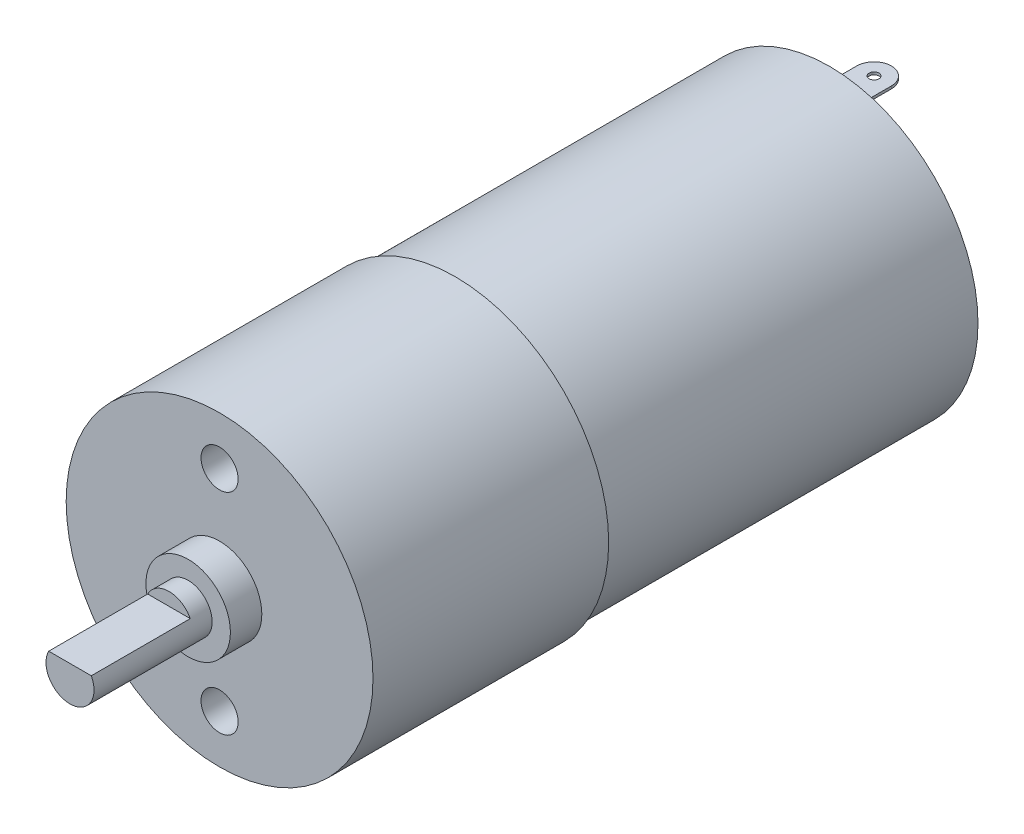
ISO-10303-21;
HEADER;
FILE_DESCRIPTION(('STEP AP214'),'2;1');
FILE_NAME('part.step','',(''),(''),'','','');
FILE_SCHEMA(('AUTOMOTIVE_DESIGN { 1 0 10303 214 1 1 1 1 }'));
ENDSEC;
DATA;
#1=APPLICATION_CONTEXT('core data for automotive mechanical design processes');
#2=APPLICATION_PROTOCOL_DEFINITION('international standard','automotive_design',2000,#1);
#3=PRODUCT_CONTEXT('',#1,'mechanical');
#4=PRODUCT('Part','Part','',(#3));
#5=PRODUCT_RELATED_PRODUCT_CATEGORY('part','',(#4));
#6=PRODUCT_DEFINITION_FORMATION('','',#4);
#7=PRODUCT_DEFINITION_CONTEXT('part definition',#1,'design');
#8=PRODUCT_DEFINITION('design','',#6,#7);
#9=PRODUCT_DEFINITION_SHAPE('','',#8);
#10=(LENGTH_UNIT() NAMED_UNIT(*) SI_UNIT(.MILLI.,.METRE.));
#11=(NAMED_UNIT(*) PLANE_ANGLE_UNIT() SI_UNIT($,.RADIAN.));
#12=(NAMED_UNIT(*) SI_UNIT($,.STERADIAN.) SOLID_ANGLE_UNIT());
#13=UNCERTAINTY_MEASURE_WITH_UNIT(LENGTH_MEASURE(1.E-05),#10,'distance_accuracy_value','');
#14=(GEOMETRIC_REPRESENTATION_CONTEXT(3) GLOBAL_UNCERTAINTY_ASSIGNED_CONTEXT((#13)) GLOBAL_UNIT_ASSIGNED_CONTEXT((#10,
#11,#12)) REPRESENTATION_CONTEXT('',''));
#15=CARTESIAN_POINT('',(0.,0.,0.));
#16=DIRECTION('',(0.,0.,1.));
#17=DIRECTION('',(1.,0.,0.));
#18=AXIS2_PLACEMENT_3D('',#15,#16,#17);
#19=CARTESIAN_POINT('',(0.,0.,-49.3));
#20=DIRECTION('',(0.,0.,-1.));
#21=DIRECTION('',(-1.,0.,0.));
#22=AXIS2_PLACEMENT_3D('',#19,#20,#21);
#23=PLANE('',#22);
#24=DIRECTION('',(-1.,0.,0.));
#25=VECTOR('',#24,1.);
#26=CARTESIAN_POINT('',(1.4,9.315,-49.3));
#27=LINE('',#26,#25);
#28=CARTESIAN_POINT('',(1.4,9.315,-49.3));
#29=VERTEX_POINT('',#28);
#30=CARTESIAN_POINT('',(-1.4,9.315,-49.3));
#31=VERTEX_POINT('',#30);
#32=EDGE_CURVE('E170',#29,#31,#27,.T.);
#33=ORIENTED_EDGE('',*,*,#32,.F.);
#34=DIRECTION('',(0.,-1.,0.));
#35=VECTOR('',#34,1.);
#36=CARTESIAN_POINT('',(1.4,9.525,-49.3));
#37=LINE('',#36,#35);
#38=CARTESIAN_POINT('',(1.4,9.525,-49.3));
#39=VERTEX_POINT('',#38);
#40=EDGE_CURVE('E143',#39,#29,#37,.T.);
#41=ORIENTED_EDGE('',*,*,#40,.F.);
#42=DIRECTION('',(1.,0.,0.));
#43=VECTOR('',#42,1.);
#44=CARTESIAN_POINT('',(1.4,9.525,-49.3));
#45=LINE('',#44,#43);
#46=CARTESIAN_POINT('',(-1.4,9.525,-49.3));
#47=VERTEX_POINT('',#46);
#48=EDGE_CURVE('E176',#47,#39,#45,.T.);
#49=ORIENTED_EDGE('',*,*,#48,.F.);
#50=DIRECTION('',(0.,1.,0.));
#51=VECTOR('',#50,1.);
#52=CARTESIAN_POINT('',(-1.4,9.525,-49.3));
#53=LINE('',#52,#51);
#54=EDGE_CURVE('E173',#31,#47,#53,.T.);
#55=ORIENTED_EDGE('',*,*,#54,.F.);
#56=EDGE_LOOP('',(#33,#41,#49,#55));
#57=FACE_BOUND('',#56,.T.);
#58=CARTESIAN_POINT('',(0.,0.,-49.3));
#59=DIRECTION('',(0.,0.,-1.));
#60=DIRECTION('',(-1.,0.,0.));
#61=AXIS2_PLACEMENT_3D('',#58,#59,#60);
#62=CIRCLE('',#61,12.);
#63=CARTESIAN_POINT('',(-12.,0.,-49.3));
#64=VERTEX_POINT('',#63);
#65=EDGE_CURVE('E202',#64,#64,#62,.T.);
#66=ORIENTED_EDGE('',*,*,#65,.T.);
#67=EDGE_LOOP('',(#66));
#68=FACE_BOUND('',#67,.T.);
#69=DIRECTION('',(0.,1.,0.));
#70=VECTOR('',#69,1.);
#71=CARTESIAN_POINT('',(-3.2,2.70482901492867,-49.3));
#72=LINE('',#71,#70);
#73=CARTESIAN_POINT('',(-3.2,-2.70482901492867,-49.3));
#74=VERTEX_POINT('',#73);
#75=CARTESIAN_POINT('',(-3.2,2.70482901492867,-49.3));
#76=VERTEX_POINT('',#75);
#77=EDGE_CURVE('E189',#74,#76,#72,.T.);
#78=ORIENTED_EDGE('',*,*,#77,.F.);
#79=CARTESIAN_POINT('',(0.,0.,-49.3));
#80=DIRECTION('',(0.,0.,-1.));
#81=DIRECTION('',(-1.,0.,0.));
#82=AXIS2_PLACEMENT_3D('',#79,#80,#81);
#83=CIRCLE('',#82,4.19);
#84=EDGE_CURVE('E187',#76,#74,#83,.T.);
#85=ORIENTED_EDGE('',*,*,#84,.F.);
#86=EDGE_LOOP('',(#78,#85));
#87=FACE_BOUND('',#86,.T.);
#88=DIRECTION('',(-1.,0.,0.));
#89=VECTOR('',#88,1.);
#90=CARTESIAN_POINT('',(1.4,-9.525,-49.3));
#91=LINE('',#90,#89);
#92=CARTESIAN_POINT('',(1.4,-9.525,-49.3));
#93=VERTEX_POINT('',#92);
#94=CARTESIAN_POINT('',(-1.4,-9.525,-49.3));
#95=VERTEX_POINT('',#94);
#96=EDGE_CURVE('E137',#93,#95,#91,.T.);
#97=ORIENTED_EDGE('',*,*,#96,.F.);
#98=DIRECTION('',(0.,-1.,0.));
#99=VECTOR('',#98,1.);
#100=CARTESIAN_POINT('',(1.4,-9.315,-49.3));
#101=LINE('',#100,#99);
#102=CARTESIAN_POINT('',(1.4,-9.315,-49.3));
#103=VERTEX_POINT('',#102);
#104=EDGE_CURVE('E147',#103,#93,#101,.T.);
#105=ORIENTED_EDGE('',*,*,#104,.F.);
#106=DIRECTION('',(1.,0.,0.));
#107=VECTOR('',#106,1.);
#108=CARTESIAN_POINT('',(1.4,-9.315,-49.3));
#109=LINE('',#108,#107);
#110=CARTESIAN_POINT('',(-1.4,-9.315,-49.3));
#111=VERTEX_POINT('',#110);
#112=EDGE_CURVE('E159',#111,#103,#109,.T.);
#113=ORIENTED_EDGE('',*,*,#112,.F.);
#114=DIRECTION('',(0.,1.,0.));
#115=VECTOR('',#114,1.);
#116=CARTESIAN_POINT('',(-1.4,-9.315,-49.3));
#117=LINE('',#116,#115);
#118=EDGE_CURVE('E157',#95,#111,#117,.T.);
#119=ORIENTED_EDGE('',*,*,#118,.F.);
#120=EDGE_LOOP('',(#97,#105,#113,#119));
#121=FACE_BOUND('',#120,.T.);
#122=ADVANCED_FACE('F34',(#57,#68,#87,#121),#23,.T.);
#123=CARTESIAN_POINT('',(0.,0.,-19.05));
#124=DIRECTION('',(0.,0.,1.));
#125=DIRECTION('',(1.,0.,0.));
#126=AXIS2_PLACEMENT_3D('',#123,#124,#125);
#127=PLANE('',#126);
#128=CARTESIAN_POINT('',(0.,0.,-19.05));
#129=DIRECTION('',(0.,0.,1.));
#130=DIRECTION('',(1.,0.,0.));
#131=AXIS2_PLACEMENT_3D('',#128,#129,#130);
#132=CIRCLE('',#131,12.4);
#133=CARTESIAN_POINT('',(12.4,0.,-19.05));
#134=VERTEX_POINT('',#133);
#135=EDGE_CURVE('E229',#134,#134,#132,.T.);
#136=ORIENTED_EDGE('',*,*,#135,.F.);
#137=EDGE_LOOP('',(#136));
#138=FACE_BOUND('',#137,.T.);
#139=CARTESIAN_POINT('',(0.,0.,-19.05));
#140=DIRECTION('',(0.,0.,1.));
#141=DIRECTION('',(1.,0.,0.));
#142=AXIS2_PLACEMENT_3D('',#139,#140,#141);
#143=CIRCLE('',#142,12.);
#144=CARTESIAN_POINT('',(12.,0.,-19.05));
#145=VERTEX_POINT('',#144);
#146=EDGE_CURVE('E236',#145,#145,#143,.F.);
#147=ORIENTED_EDGE('',*,*,#146,.F.);
#148=EDGE_LOOP('',(#147));
#149=FACE_BOUND('',#148,.T.);
#150=ADVANCED_FACE('F335',(#138,#149),#127,.F.);
#151=CARTESIAN_POINT('',(0.,0.,2.54));
#152=DIRECTION('',(0.,0.,1.));
#153=DIRECTION('',(1.,0.,0.));
#154=AXIS2_PLACEMENT_3D('',#151,#152,#153);
#155=PLANE('',#154);
#156=CARTESIAN_POINT('',(0.,0.,2.54));
#157=DIRECTION('',(0.,0.,1.));
#158=DIRECTION('',(1.,0.,0.));
#159=AXIS2_PLACEMENT_3D('',#156,#157,#158);
#160=CIRCLE('',#159,3.415);
#161=CARTESIAN_POINT('',(3.415,0.,2.54));
#162=VERTEX_POINT('',#161);
#163=EDGE_CURVE('E223',#162,#162,#160,.T.);
#164=ORIENTED_EDGE('',*,*,#163,.T.);
#165=EDGE_LOOP('',(#164));
#166=FACE_BOUND('',#165,.T.);
#167=CARTESIAN_POINT('',(0.,0.,2.54));
#168=DIRECTION('',(0.,0.,1.));
#169=DIRECTION('',(1.,0.,0.));
#170=AXIS2_PLACEMENT_3D('',#167,#168,#169);
#171=CIRCLE('',#170,1.94);
#172=CARTESIAN_POINT('',(1.94,0.,2.54));
#173=VERTEX_POINT('',#172);
#174=EDGE_CURVE('E214',#173,#173,#171,.T.);
#175=ORIENTED_EDGE('',*,*,#174,.F.);
#176=EDGE_LOOP('',(#175));
#177=FACE_BOUND('',#176,.T.);
#178=ADVANCED_FACE('F311',(#166,#177),#155,.T.);
#179=CARTESIAN_POINT('',(0.,0.,0.));
#180=DIRECTION('',(0.,0.,1.));
#181=DIRECTION('',(1.,0.,0.));
#182=AXIS2_PLACEMENT_3D('',#179,#180,#181);
#183=PLANE('',#182);
#184=CARTESIAN_POINT('',(0.,-8.5,0.));
#185=DIRECTION('',(0.,0.,1.));
#186=DIRECTION('',(1.,0.,0.));
#187=AXIS2_PLACEMENT_3D('',#184,#185,#186);
#188=CIRCLE('',#187,1.5);
#189=CARTESIAN_POINT('',(1.5,-8.5,0.));
#190=VERTEX_POINT('',#189);
#191=EDGE_CURVE('E302',#190,#190,#188,.T.);
#192=ORIENTED_EDGE('',*,*,#191,.F.);
#193=EDGE_LOOP('',(#192));
#194=FACE_BOUND('',#193,.T.);
#195=CARTESIAN_POINT('',(0.,8.5,0.));
#196=DIRECTION('',(0.,0.,1.));
#197=DIRECTION('',(1.,0.,0.));
#198=AXIS2_PLACEMENT_3D('',#195,#196,#197);
#199=CIRCLE('',#198,1.5);
#200=CARTESIAN_POINT('',(1.5,8.5,0.));
#201=VERTEX_POINT('',#200);
#202=EDGE_CURVE('E296',#201,#201,#199,.T.);
#203=ORIENTED_EDGE('',*,*,#202,.F.);
#204=EDGE_LOOP('',(#203));
#205=FACE_BOUND('',#204,.T.);
#206=CARTESIAN_POINT('',(0.,0.,0.));
#207=DIRECTION('',(0.,0.,1.));
#208=DIRECTION('',(1.,0.,0.));
#209=AXIS2_PLACEMENT_3D('',#206,#207,#208);
#210=CIRCLE('',#209,12.4);
#211=CARTESIAN_POINT('',(12.4,0.,0.));
#212=VERTEX_POINT('',#211);
#213=EDGE_CURVE('E226',#212,#212,#210,.T.);
#214=ORIENTED_EDGE('',*,*,#213,.T.);
#215=EDGE_LOOP('',(#214));
#216=FACE_BOUND('',#215,.T.);
#217=CARTESIAN_POINT('',(0.,0.,0.));
#218=DIRECTION('',(0.,0.,1.));
#219=DIRECTION('',(1.,0.,0.));
#220=AXIS2_PLACEMENT_3D('',#217,#218,#219);
#221=CIRCLE('',#220,3.415);
#222=CARTESIAN_POINT('',(3.415,0.,0.));
#223=VERTEX_POINT('',#222);
#224=EDGE_CURVE('E220',#223,#223,#221,.T.);
#225=ORIENTED_EDGE('',*,*,#224,.F.);
#226=EDGE_LOOP('',(#225));
#227=FACE_BOUND('',#226,.T.);
#228=ADVANCED_FACE('F308',(#194,#205,#216,#227),#183,.T.);
#229=CARTESIAN_POINT('',(0.,0.,-19.05));
#230=DIRECTION('',(0.,0.,1.));
#231=DIRECTION('',(1.,0.,0.));
#232=AXIS2_PLACEMENT_3D('',#229,#230,#231);
#233=CYLINDRICAL_SURFACE('',#232,12.4);
#234=ORIENTED_EDGE('',*,*,#135,.T.);
#235=EDGE_LOOP('',(#234));
#236=FACE_BOUND('',#235,.T.);
#237=ORIENTED_EDGE('',*,*,#213,.F.);
#238=EDGE_LOOP('',(#237));
#239=FACE_BOUND('',#238,.T.);
#240=ADVANCED_FACE('F36',(#236,#239),#233,.T.);
#241=CARTESIAN_POINT('',(0.,0.,2.54));
#242=DIRECTION('',(0.,0.,-1.));
#243=DIRECTION('',(-1.,0.,0.));
#244=AXIS2_PLACEMENT_3D('',#241,#242,#243);
#245=CYLINDRICAL_SURFACE('',#244,3.415);
#246=ORIENTED_EDGE('',*,*,#163,.F.);
#247=EDGE_LOOP('',(#246));
#248=FACE_BOUND('',#247,.T.);
#249=ORIENTED_EDGE('',*,*,#224,.T.);
#250=EDGE_LOOP('',(#249));
#251=FACE_BOUND('',#250,.T.);
#252=ADVANCED_FACE('F319',(#248,#251),#245,.T.);
#253=CARTESIAN_POINT('',(0.,0.,12.09));
#254=DIRECTION('',(0.,0.,-1.));
#255=DIRECTION('',(-1.,0.,0.));
#256=AXIS2_PLACEMENT_3D('',#253,#254,#255);
#257=CYLINDRICAL_SURFACE('',#256,1.94);
#258=CARTESIAN_POINT('',(0.,0.,12.09));
#259=DIRECTION('',(0.,0.,1.));
#260=DIRECTION('',(1.,0.,0.));
#261=AXIS2_PLACEMENT_3D('',#258,#259,#260);
#262=CIRCLE('',#261,1.94);
#263=CARTESIAN_POINT('',(-1.72122780344341,0.89497198204936,12.09));
#264=VERTEX_POINT('',#263);
#265=CARTESIAN_POINT('',(1.72122780344341,0.89497198204936,12.09));
#266=VERTEX_POINT('',#265);
#267=EDGE_CURVE('E217',#264,#266,#262,.T.);
#268=ORIENTED_EDGE('',*,*,#267,.F.);
#269=DIRECTION('',(0.,0.,-1.));
#270=VECTOR('',#269,1.);
#271=CARTESIAN_POINT('',(-1.72122780344341,0.89497198204936,12.09));
#272=LINE('',#271,#270);
#273=CARTESIAN_POINT('',(-1.72122780344341,0.89497198204936,4.09));
#274=VERTEX_POINT('',#273);
#275=EDGE_CURVE('E211',#264,#274,#272,.T.);
#276=ORIENTED_EDGE('',*,*,#275,.T.);
#277=CARTESIAN_POINT('',(0.,0.,4.09));
#278=DIRECTION('',(0.,0.,1.));
#279=DIRECTION('',(1.,0.,0.));
#280=AXIS2_PLACEMENT_3D('',#277,#278,#279);
#281=CIRCLE('',#280,1.94);
#282=CARTESIAN_POINT('',(1.72122780344341,0.89497198204936,4.09));
#283=VERTEX_POINT('',#282);
#284=EDGE_CURVE('E234',#283,#274,#281,.T.);
#285=ORIENTED_EDGE('',*,*,#284,.F.);
#286=DIRECTION('',(0.,0.,-1.));
#287=VECTOR('',#286,1.);
#288=CARTESIAN_POINT('',(1.72122780344341,0.89497198204936,12.09));
#289=LINE('',#288,#287);
#290=EDGE_CURVE('E208',#283,#266,#289,.F.);
#291=ORIENTED_EDGE('',*,*,#290,.T.);
#292=EDGE_LOOP('',(#268,#276,#285,#291));
#293=FACE_BOUND('',#292,.T.);
#294=ORIENTED_EDGE('',*,*,#174,.T.);
#295=EDGE_LOOP('',(#294));
#296=FACE_BOUND('',#295,.T.);
#297=ADVANCED_FACE('F321',(#293,#296),#257,.T.);
#298=CARTESIAN_POINT('',(0.,0.,12.09));
#299=DIRECTION('',(0.,0.,1.));
#300=DIRECTION('',(1.,0.,0.));
#301=AXIS2_PLACEMENT_3D('',#298,#299,#300);
#302=PLANE('',#301);
#303=DIRECTION('',(1.,0.,0.));
#304=VECTOR('',#303,1.);
#305=CARTESIAN_POINT('',(0.,0.89497198204936,12.09));
#306=LINE('',#305,#304);
#307=EDGE_CURVE('E232',#264,#266,#306,.T.);
#308=ORIENTED_EDGE('',*,*,#307,.F.);
#309=ORIENTED_EDGE('',*,*,#267,.T.);
#310=EDGE_LOOP('',(#308,#309));
#311=FACE_BOUND('',#310,.T.);
#312=ADVANCED_FACE('F328',(#311),#302,.T.);
#313=CARTESIAN_POINT('',(0.,0.,4.09));
#314=DIRECTION('',(0.,0.,1.));
#315=DIRECTION('',(1.,0.,0.));
#316=AXIS2_PLACEMENT_3D('',#313,#314,#315);
#317=PLANE('',#316);
#318=ORIENTED_EDGE('',*,*,#284,.T.);
#319=DIRECTION('',(1.,0.,0.));
#320=VECTOR('',#319,1.);
#321=CARTESIAN_POINT('',(-2.33431470700646,0.89497198204936,4.09));
#322=LINE('',#321,#320);
#323=EDGE_CURVE('E205',#274,#283,#322,.T.);
#324=ORIENTED_EDGE('',*,*,#323,.T.);
#325=EDGE_LOOP('',(#318,#324));
#326=FACE_BOUND('',#325,.T.);
#327=ADVANCED_FACE('F350',(#326),#317,.T.);
#328=CARTESIAN_POINT('',(-2.33431470700646,0.89497198204936,4.09));
#329=DIRECTION('',(0.,-1.,0.));
#330=DIRECTION('',(0.,0.,-1.));
#331=AXIS2_PLACEMENT_3D('',#328,#329,#330);
#332=PLANE('',#331);
#333=ORIENTED_EDGE('',*,*,#307,.T.);
#334=ORIENTED_EDGE('',*,*,#290,.F.);
#335=ORIENTED_EDGE('',*,*,#323,.F.);
#336=ORIENTED_EDGE('',*,*,#275,.F.);
#337=EDGE_LOOP('',(#333,#334,#335,#336));
#338=FACE_BOUND('',#337,.T.);
#339=ADVANCED_FACE('F348',(#338),#332,.F.);
#340=CARTESIAN_POINT('',(0.,0.,-49.3));
#341=DIRECTION('',(0.,0.,1.));
#342=DIRECTION('',(1.,0.,0.));
#343=AXIS2_PLACEMENT_3D('',#340,#341,#342);
#344=CYLINDRICAL_SURFACE('',#343,12.);
#345=ORIENTED_EDGE('',*,*,#65,.F.);
#346=EDGE_LOOP('',(#345));
#347=FACE_BOUND('',#346,.T.);
#348=ORIENTED_EDGE('',*,*,#146,.T.);
#349=EDGE_LOOP('',(#348));
#350=FACE_BOUND('',#349,.T.);
#351=ADVANCED_FACE('F345',(#347,#350),#344,.T.);
#352=CARTESIAN_POINT('',(0.,0.,-51.3));
#353=DIRECTION('',(0.,0.,1.));
#354=DIRECTION('',(1.,0.,0.));
#355=AXIS2_PLACEMENT_3D('',#352,#353,#354);
#356=CYLINDRICAL_SURFACE('',#355,4.19);
#357=ORIENTED_EDGE('',*,*,#84,.T.);
#358=DIRECTION('',(0.,0.,1.));
#359=VECTOR('',#358,1.);
#360=CARTESIAN_POINT('',(-3.2,-2.70482901492867,-51.3));
#361=LINE('',#360,#359);
#362=CARTESIAN_POINT('',(-3.2,-2.70482901492867,-51.3));
#363=VERTEX_POINT('',#362);
#364=EDGE_CURVE('E199',#363,#74,#361,.T.);
#365=ORIENTED_EDGE('',*,*,#364,.F.);
#366=CARTESIAN_POINT('',(0.,0.,-51.3));
#367=DIRECTION('',(0.,0.,-1.));
#368=DIRECTION('',(-1.,0.,0.));
#369=AXIS2_PLACEMENT_3D('',#366,#367,#368);
#370=CIRCLE('',#369,4.19);
#371=CARTESIAN_POINT('',(-3.2,2.70482901492867,-51.3));
#372=VERTEX_POINT('',#371);
#373=EDGE_CURVE('E191',#372,#363,#370,.T.);
#374=ORIENTED_EDGE('',*,*,#373,.F.);
#375=DIRECTION('',(0.,0.,1.));
#376=VECTOR('',#375,1.);
#377=CARTESIAN_POINT('',(-3.2,2.70482901492867,-51.3));
#378=LINE('',#377,#376);
#379=EDGE_CURVE('E196',#372,#76,#378,.T.);
#380=ORIENTED_EDGE('',*,*,#379,.T.);
#381=EDGE_LOOP('',(#357,#365,#374,#380));
#382=FACE_BOUND('',#381,.T.);
#383=ADVANCED_FACE('F343',(#382),#356,.T.);
#384=CARTESIAN_POINT('',(-3.2,2.70482901492867,-51.3));
#385=DIRECTION('',(1.,0.,0.));
#386=DIRECTION('',(0.,1.,0.));
#387=AXIS2_PLACEMENT_3D('',#384,#385,#386);
#388=PLANE('',#387);
#389=ORIENTED_EDGE('',*,*,#77,.T.);
#390=ORIENTED_EDGE('',*,*,#379,.F.);
#391=DIRECTION('',(0.,1.,0.));
#392=VECTOR('',#391,1.);
#393=CARTESIAN_POINT('',(-3.2,2.70482901492867,-51.3));
#394=LINE('',#393,#392);
#395=EDGE_CURVE('E194',#363,#372,#394,.T.);
#396=ORIENTED_EDGE('',*,*,#395,.F.);
#397=ORIENTED_EDGE('',*,*,#364,.T.);
#398=EDGE_LOOP('',(#389,#390,#396,#397));
#399=FACE_BOUND('',#398,.T.);
#400=ADVANCED_FACE('F420',(#399),#388,.F.);
#401=CARTESIAN_POINT('',(0.,0.,-51.3));
#402=DIRECTION('',(0.,0.,-1.));
#403=DIRECTION('',(-1.,0.,0.));
#404=AXIS2_PLACEMENT_3D('',#401,#402,#403);
#405=PLANE('',#404);
#406=ORIENTED_EDGE('',*,*,#373,.T.);
#407=ORIENTED_EDGE('',*,*,#395,.T.);
#408=EDGE_LOOP('',(#406,#407));
#409=FACE_BOUND('',#408,.T.);
#410=ADVANCED_FACE('F429',(#409),#405,.T.);
#411=CARTESIAN_POINT('',(1.4,9.525,-54.3));
#412=DIRECTION('',(-1.,0.,0.));
#413=DIRECTION('',(0.,0.,1.));
#414=AXIS2_PLACEMENT_3D('',#411,#412,#413);
#415=PLANE('',#414);
#416=DIRECTION('',(0.,0.,1.));
#417=VECTOR('',#416,1.);
#418=CARTESIAN_POINT('',(1.4,9.315,-54.3));
#419=LINE('',#418,#417);
#420=CARTESIAN_POINT('',(1.4,9.315,-52.9));
#421=VERTEX_POINT('',#420);
#422=EDGE_CURVE('E185',#421,#29,#419,.T.);
#423=ORIENTED_EDGE('',*,*,#422,.F.);
#424=DIRECTION('',(0.,-1.,0.));
#425=VECTOR('',#424,1.);
#426=CARTESIAN_POINT('',(1.4,9.525,-52.9));
#427=LINE('',#426,#425);
#428=CARTESIAN_POINT('',(1.4,9.525,-52.9));
#429=VERTEX_POINT('',#428);
#430=EDGE_CURVE('E11',#421,#429,#427,.F.);
#431=ORIENTED_EDGE('',*,*,#430,.T.);
#432=DIRECTION('',(0.,0.,1.));
#433=VECTOR('',#432,1.);
#434=CARTESIAN_POINT('',(1.4,9.525,-54.3));
#435=LINE('',#434,#433);
#436=EDGE_CURVE('E179',#429,#39,#435,.T.);
#437=ORIENTED_EDGE('',*,*,#436,.T.);
#438=ORIENTED_EDGE('',*,*,#40,.T.);
#439=EDGE_LOOP('',(#423,#431,#437,#438));
#440=FACE_BOUND('',#439,.T.);
#441=ADVANCED_FACE('F438',(#440),#415,.F.);
#442=CARTESIAN_POINT('',(1.4,9.315,-54.3));
#443=DIRECTION('',(0.,1.,0.));
#444=DIRECTION('',(0.,0.,1.));
#445=AXIS2_PLACEMENT_3D('',#442,#443,#444);
#446=PLANE('',#445);
#447=CARTESIAN_POINT('',(0.,9.315,-52.9));
#448=DIRECTION('',(0.,1.,0.));
#449=DIRECTION('',(0.,0.,1.));
#450=AXIS2_PLACEMENT_3D('',#447,#448,#449);
#451=CIRCLE('',#450,0.399999999999999);
#452=CARTESIAN_POINT('',(0.,9.315,-52.5));
#453=VERTEX_POINT('',#452);
#454=EDGE_CURVE('E281',#453,#453,#451,.T.);
#455=ORIENTED_EDGE('',*,*,#454,.T.);
#456=EDGE_LOOP('',(#455));
#457=FACE_BOUND('',#456,.T.);
#458=DIRECTION('',(0.,0.,1.));
#459=VECTOR('',#458,1.);
#460=CARTESIAN_POINT('',(-1.4,9.315,-54.3));
#461=LINE('',#460,#459);
#462=CARTESIAN_POINT('',(-1.4,9.315,-52.9));
#463=VERTEX_POINT('',#462);
#464=EDGE_CURVE('E183',#463,#31,#461,.T.);
#465=ORIENTED_EDGE('',*,*,#464,.F.);
#466=CARTESIAN_POINT('',(0.,9.315,-52.9));
#467=DIRECTION('',(0.,1.,0.));
#468=DIRECTION('',(0.,0.,1.));
#469=AXIS2_PLACEMENT_3D('',#466,#467,#468);
#470=CIRCLE('',#469,1.4);
#471=CARTESIAN_POINT('',(0.,9.315,-54.3));
#472=VERTEX_POINT('',#471);
#473=EDGE_CURVE('E43',#463,#472,#470,.F.);
#474=ORIENTED_EDGE('',*,*,#473,.T.);
#475=CARTESIAN_POINT('',(0.,9.315,-52.9));
#476=DIRECTION('',(0.,1.,0.));
#477=DIRECTION('',(0.,0.,1.));
#478=AXIS2_PLACEMENT_3D('',#475,#476,#477);
#479=CIRCLE('',#478,1.4);
#480=EDGE_CURVE('E50',#472,#421,#479,.F.);
#481=ORIENTED_EDGE('',*,*,#480,.T.);
#482=ORIENTED_EDGE('',*,*,#422,.T.);
#483=ORIENTED_EDGE('',*,*,#32,.T.);
#484=EDGE_LOOP('',(#465,#474,#481,#482,#483));
#485=FACE_BOUND('',#484,.T.);
#486=ADVANCED_FACE('F265',(#457,#485),#446,.F.);
#487=CARTESIAN_POINT('',(-1.4,9.525,-54.3));
#488=DIRECTION('',(1.,0.,0.));
#489=DIRECTION('',(0.,0.,-1.));
#490=AXIS2_PLACEMENT_3D('',#487,#488,#489);
#491=PLANE('',#490);
#492=DIRECTION('',(0.,0.,1.));
#493=VECTOR('',#492,1.);
#494=CARTESIAN_POINT('',(-1.4,9.525,-54.3));
#495=LINE('',#494,#493);
#496=CARTESIAN_POINT('',(-1.4,9.525,-52.9));
#497=VERTEX_POINT('',#496);
#498=EDGE_CURVE('E181',#497,#47,#495,.T.);
#499=ORIENTED_EDGE('',*,*,#498,.F.);
#500=DIRECTION('',(0.,1.,0.));
#501=VECTOR('',#500,1.);
#502=CARTESIAN_POINT('',(-1.4,9.315,-52.9));
#503=LINE('',#502,#501);
#504=EDGE_CURVE('E255',#497,#463,#503,.F.);
#505=ORIENTED_EDGE('',*,*,#504,.T.);
#506=ORIENTED_EDGE('',*,*,#464,.T.);
#507=ORIENTED_EDGE('',*,*,#54,.T.);
#508=EDGE_LOOP('',(#499,#505,#506,#507));
#509=FACE_BOUND('',#508,.T.);
#510=ADVANCED_FACE('F262',(#509),#491,.F.);
#511=CARTESIAN_POINT('',(1.4,9.525,-54.3));
#512=DIRECTION('',(0.,-1.,0.));
#513=DIRECTION('',(0.,0.,-1.));
#514=AXIS2_PLACEMENT_3D('',#511,#512,#513);
#515=PLANE('',#514);
#516=CARTESIAN_POINT('',(0.,9.525,-52.9));
#517=DIRECTION('',(0.,1.,0.));
#518=DIRECTION('',(0.,0.,1.));
#519=AXIS2_PLACEMENT_3D('',#516,#517,#518);
#520=CIRCLE('',#519,0.399999999999999);
#521=CARTESIAN_POINT('',(0.,9.525,-52.5));
#522=VERTEX_POINT('',#521);
#523=EDGE_CURVE('E290',#522,#522,#520,.T.);
#524=ORIENTED_EDGE('',*,*,#523,.F.);
#525=EDGE_LOOP('',(#524));
#526=FACE_BOUND('',#525,.T.);
#527=CARTESIAN_POINT('',(0.,9.525,-52.9));
#528=DIRECTION('',(0.,-1.,0.));
#529=DIRECTION('',(0.,0.,-1.));
#530=AXIS2_PLACEMENT_3D('',#527,#528,#529);
#531=CIRCLE('',#530,1.4);
#532=CARTESIAN_POINT('',(0.,9.525,-54.3));
#533=VERTEX_POINT('',#532);
#534=EDGE_CURVE('E251',#429,#533,#531,.F.);
#535=ORIENTED_EDGE('',*,*,#534,.T.);
#536=CARTESIAN_POINT('',(0.,9.525,-52.9));
#537=DIRECTION('',(0.,-1.,0.));
#538=DIRECTION('',(0.,0.,-1.));
#539=AXIS2_PLACEMENT_3D('',#536,#537,#538);
#540=CIRCLE('',#539,1.4);
#541=EDGE_CURVE('E253',#533,#497,#540,.F.);
#542=ORIENTED_EDGE('',*,*,#541,.T.);
#543=ORIENTED_EDGE('',*,*,#498,.T.);
#544=ORIENTED_EDGE('',*,*,#48,.T.);
#545=ORIENTED_EDGE('',*,*,#436,.F.);
#546=EDGE_LOOP('',(#535,#542,#543,#544,#545));
#547=FACE_BOUND('',#546,.T.);
#548=ADVANCED_FACE('F274',(#526,#547),#515,.F.);
#549=CARTESIAN_POINT('',(1.4,-9.315,-54.3));
#550=DIRECTION('',(-1.,0.,0.));
#551=DIRECTION('',(0.,0.,1.));
#552=AXIS2_PLACEMENT_3D('',#549,#550,#551);
#553=PLANE('',#552);
#554=DIRECTION('',(0.,0.,1.));
#555=VECTOR('',#554,1.);
#556=CARTESIAN_POINT('',(1.4,-9.525,-54.3));
#557=LINE('',#556,#555);
#558=CARTESIAN_POINT('',(1.4,-9.525,-52.9));
#559=VERTEX_POINT('',#558);
#560=EDGE_CURVE('E132',#559,#93,#557,.T.);
#561=ORIENTED_EDGE('',*,*,#560,.F.);
#562=DIRECTION('',(0.,-1.,0.));
#563=VECTOR('',#562,1.);
#564=CARTESIAN_POINT('',(1.4,-9.315,-52.9));
#565=LINE('',#564,#563);
#566=CARTESIAN_POINT('',(1.4,-9.315,-52.9));
#567=VERTEX_POINT('',#566);
#568=EDGE_CURVE('E249',#559,#567,#565,.F.);
#569=ORIENTED_EDGE('',*,*,#568,.T.);
#570=DIRECTION('',(0.,0.,1.));
#571=VECTOR('',#570,1.);
#572=CARTESIAN_POINT('',(1.4,-9.315,-54.3));
#573=LINE('',#572,#571);
#574=EDGE_CURVE('E150',#567,#103,#573,.T.);
#575=ORIENTED_EDGE('',*,*,#574,.T.);
#576=ORIENTED_EDGE('',*,*,#104,.T.);
#577=EDGE_LOOP('',(#561,#569,#575,#576));
#578=FACE_BOUND('',#577,.T.);
#579=ADVANCED_FACE('F148',(#578),#553,.F.);
#580=CARTESIAN_POINT('',(1.4,-9.525,-54.3));
#581=DIRECTION('',(0.,1.,0.));
#582=DIRECTION('',(0.,0.,1.));
#583=AXIS2_PLACEMENT_3D('',#580,#581,#582);
#584=PLANE('',#583);
#585=CARTESIAN_POINT('',(0.,-9.525,-52.9));
#586=DIRECTION('',(0.,1.,0.));
#587=DIRECTION('',(0.,0.,1.));
#588=AXIS2_PLACEMENT_3D('',#585,#586,#587);
#589=CIRCLE('',#588,0.399999999999999);
#590=CARTESIAN_POINT('',(0.,-9.525,-52.5));
#591=VERTEX_POINT('',#590);
#592=EDGE_CURVE('E285',#591,#591,#589,.T.);
#593=ORIENTED_EDGE('',*,*,#592,.T.);
#594=EDGE_LOOP('',(#593));
#595=FACE_BOUND('',#594,.T.);
#596=DIRECTION('',(0.,0.,1.));
#597=VECTOR('',#596,1.);
#598=CARTESIAN_POINT('',(-1.4,-9.525,-54.3));
#599=LINE('',#598,#597);
#600=CARTESIAN_POINT('',(-1.4,-9.525,-52.9));
#601=VERTEX_POINT('',#600);
#602=EDGE_CURVE('E144',#601,#95,#599,.T.);
#603=ORIENTED_EDGE('',*,*,#602,.F.);
#604=CARTESIAN_POINT('',(0.,-9.525,-52.9));
#605=DIRECTION('',(0.,1.,0.));
#606=DIRECTION('',(0.,0.,1.));
#607=AXIS2_PLACEMENT_3D('',#604,#605,#606);
#608=CIRCLE('',#607,1.4);
#609=CARTESIAN_POINT('',(0.,-9.525,-54.3));
#610=VERTEX_POINT('',#609);
#611=EDGE_CURVE('E247',#601,#610,#608,.F.);
#612=ORIENTED_EDGE('',*,*,#611,.T.);
#613=CARTESIAN_POINT('',(0.,-9.525,-52.9));
#614=DIRECTION('',(0.,1.,0.));
#615=DIRECTION('',(0.,0.,1.));
#616=AXIS2_PLACEMENT_3D('',#613,#614,#615);
#617=CIRCLE('',#616,1.4);
#618=EDGE_CURVE('E140',#610,#559,#617,.F.);
#619=ORIENTED_EDGE('',*,*,#618,.T.);
#620=ORIENTED_EDGE('',*,*,#560,.T.);
#621=ORIENTED_EDGE('',*,*,#96,.T.);
#622=EDGE_LOOP('',(#603,#612,#619,#620,#621));
#623=FACE_BOUND('',#622,.T.);
#624=ADVANCED_FACE('F135',(#595,#623),#584,.F.);
#625=CARTESIAN_POINT('',(-1.4,-9.315,-54.3));
#626=DIRECTION('',(1.,0.,0.));
#627=DIRECTION('',(0.,0.,-1.));
#628=AXIS2_PLACEMENT_3D('',#625,#626,#627);
#629=PLANE('',#628);
#630=DIRECTION('',(0.,0.,1.));
#631=VECTOR('',#630,1.);
#632=CARTESIAN_POINT('',(-1.4,-9.315,-54.3));
#633=LINE('',#632,#631);
#634=CARTESIAN_POINT('',(-1.4,-9.315,-52.9));
#635=VERTEX_POINT('',#634);
#636=EDGE_CURVE('E165',#635,#111,#633,.T.);
#637=ORIENTED_EDGE('',*,*,#636,.F.);
#638=DIRECTION('',(0.,1.,0.));
#639=VECTOR('',#638,1.);
#640=CARTESIAN_POINT('',(-1.4,-9.525,-52.9));
#641=LINE('',#640,#639);
#642=EDGE_CURVE('E243',#635,#601,#641,.F.);
#643=ORIENTED_EDGE('',*,*,#642,.T.);
#644=ORIENTED_EDGE('',*,*,#602,.T.);
#645=ORIENTED_EDGE('',*,*,#118,.T.);
#646=EDGE_LOOP('',(#637,#643,#644,#645));
#647=FACE_BOUND('',#646,.T.);
#648=ADVANCED_FACE('F492',(#647),#629,.F.);
#649=CARTESIAN_POINT('',(1.4,-9.315,-54.3));
#650=DIRECTION('',(0.,-1.,0.));
#651=DIRECTION('',(0.,0.,-1.));
#652=AXIS2_PLACEMENT_3D('',#649,#650,#651);
#653=PLANE('',#652);
#654=CARTESIAN_POINT('',(0.,-9.315,-52.9));
#655=DIRECTION('',(0.,-1.,0.));
#656=DIRECTION('',(0.,0.,-1.));
#657=AXIS2_PLACEMENT_3D('',#654,#655,#656);
#658=CIRCLE('',#657,0.399999999999999);
#659=CARTESIAN_POINT('',(0.,-9.315,-53.3));
#660=VERTEX_POINT('',#659);
#661=EDGE_CURVE('E38',#660,#660,#658,.T.);
#662=ORIENTED_EDGE('',*,*,#661,.T.);
#663=EDGE_LOOP('',(#662));
#664=FACE_BOUND('',#663,.T.);
#665=CARTESIAN_POINT('',(0.,-9.315,-52.9));
#666=DIRECTION('',(0.,-1.,0.));
#667=DIRECTION('',(0.,0.,-1.));
#668=AXIS2_PLACEMENT_3D('',#665,#666,#667);
#669=CIRCLE('',#668,1.4);
#670=CARTESIAN_POINT('',(0.,-9.315,-54.3));
#671=VERTEX_POINT('',#670);
#672=EDGE_CURVE('E239',#567,#671,#669,.F.);
#673=ORIENTED_EDGE('',*,*,#672,.T.);
#674=CARTESIAN_POINT('',(0.,-9.315,-52.9));
#675=DIRECTION('',(0.,-1.,0.));
#676=DIRECTION('',(0.,0.,-1.));
#677=AXIS2_PLACEMENT_3D('',#674,#675,#676);
#678=CIRCLE('',#677,1.4);
#679=EDGE_CURVE('E241',#671,#635,#678,.F.);
#680=ORIENTED_EDGE('',*,*,#679,.T.);
#681=ORIENTED_EDGE('',*,*,#636,.T.);
#682=ORIENTED_EDGE('',*,*,#112,.T.);
#683=ORIENTED_EDGE('',*,*,#574,.F.);
#684=EDGE_LOOP('',(#673,#680,#681,#682,#683));
#685=FACE_BOUND('',#684,.T.);
#686=ADVANCED_FACE('F502',(#664,#685),#653,.F.);
#687=CARTESIAN_POINT('',(0.,-9.525,-52.9));
#688=DIRECTION('',(0.,1.,0.));
#689=DIRECTION('',(0.,0.,1.));
#690=AXIS2_PLACEMENT_3D('',#687,#688,#689);
#691=CYLINDRICAL_SURFACE('',#690,1.4);
#692=ORIENTED_EDGE('',*,*,#568,.F.);
#693=ORIENTED_EDGE('',*,*,#618,.F.);
#694=DIRECTION('',(0.,-1.,0.));
#695=VECTOR('',#694,1.);
#696=CARTESIAN_POINT('',(0.,-9.525,-54.3));
#697=LINE('',#696,#695);
#698=EDGE_CURVE('E154',#671,#610,#697,.T.);
#699=ORIENTED_EDGE('',*,*,#698,.F.);
#700=ORIENTED_EDGE('',*,*,#672,.F.);
#701=EDGE_LOOP('',(#692,#693,#699,#700));
#702=FACE_BOUND('',#701,.T.);
#703=ADVANCED_FACE('F512',(#702),#691,.T.);
#704=CARTESIAN_POINT('',(0.,-9.525,-52.9));
#705=DIRECTION('',(0.,-1.,0.));
#706=DIRECTION('',(0.,0.,-1.));
#707=AXIS2_PLACEMENT_3D('',#704,#705,#706);
#708=CYLINDRICAL_SURFACE('',#707,1.4);
#709=ORIENTED_EDGE('',*,*,#611,.F.);
#710=ORIENTED_EDGE('',*,*,#642,.F.);
#711=ORIENTED_EDGE('',*,*,#679,.F.);
#712=ORIENTED_EDGE('',*,*,#698,.T.);
#713=EDGE_LOOP('',(#709,#710,#711,#712));
#714=FACE_BOUND('',#713,.T.);
#715=ADVANCED_FACE('F522',(#714),#708,.T.);
#716=CARTESIAN_POINT('',(0.,9.315,-52.9));
#717=DIRECTION('',(0.,1.,0.));
#718=DIRECTION('',(0.,0.,1.));
#719=AXIS2_PLACEMENT_3D('',#716,#717,#718);
#720=CYLINDRICAL_SURFACE('',#719,1.4);
#721=ORIENTED_EDGE('',*,*,#430,.F.);
#722=ORIENTED_EDGE('',*,*,#480,.F.);
#723=DIRECTION('',(0.,-1.,0.));
#724=VECTOR('',#723,1.);
#725=CARTESIAN_POINT('',(0.,9.315,-54.3));
#726=LINE('',#725,#724);
#727=EDGE_CURVE('E279',#533,#472,#726,.T.);
#728=ORIENTED_EDGE('',*,*,#727,.F.);
#729=ORIENTED_EDGE('',*,*,#534,.F.);
#730=EDGE_LOOP('',(#721,#722,#728,#729));
#731=FACE_BOUND('',#730,.T.);
#732=ADVANCED_FACE('F532',(#731),#720,.T.);
#733=CARTESIAN_POINT('',(0.,9.315,-52.9));
#734=DIRECTION('',(0.,-1.,0.));
#735=DIRECTION('',(0.,0.,-1.));
#736=AXIS2_PLACEMENT_3D('',#733,#734,#735);
#737=CYLINDRICAL_SURFACE('',#736,1.4);
#738=ORIENTED_EDGE('',*,*,#473,.F.);
#739=ORIENTED_EDGE('',*,*,#504,.F.);
#740=ORIENTED_EDGE('',*,*,#541,.F.);
#741=ORIENTED_EDGE('',*,*,#727,.T.);
#742=EDGE_LOOP('',(#738,#739,#740,#741));
#743=FACE_BOUND('',#742,.T.);
#744=ADVANCED_FACE('F278',(#743),#737,.T.);
#745=CARTESIAN_POINT('',(0.,-12.4,-52.9));
#746=DIRECTION('',(0.,1.,0.));
#747=DIRECTION('',(0.,0.,1.));
#748=AXIS2_PLACEMENT_3D('',#745,#746,#747);
#749=CYLINDRICAL_SURFACE('',#748,0.399999999999999);
#750=ORIENTED_EDGE('',*,*,#661,.F.);
#751=EDGE_LOOP('',(#750));
#752=FACE_BOUND('',#751,.T.);
#753=ORIENTED_EDGE('',*,*,#592,.F.);
#754=EDGE_LOOP('',(#753));
#755=FACE_BOUND('',#754,.T.);
#756=ADVANCED_FACE('F550',(#752,#755),#749,.F.);
#757=ORIENTED_EDGE('',*,*,#523,.T.);
#758=EDGE_LOOP('',(#757));
#759=FACE_BOUND('',#758,.T.);
#760=ORIENTED_EDGE('',*,*,#454,.F.);
#761=EDGE_LOOP('',(#760));
#762=FACE_BOUND('',#761,.T.);
#763=ADVANCED_FACE('F559',(#759,#762),#749,.F.);
#764=CARTESIAN_POINT('',(0.,8.5,-4.));
#765=DIRECTION('',(0.,0.,1.));
#766=DIRECTION('',(1.,0.,0.));
#767=AXIS2_PLACEMENT_3D('',#764,#765,#766);
#768=CYLINDRICAL_SURFACE('',#767,1.5);
#769=CARTESIAN_POINT('',(0.,8.5,-4.));
#770=DIRECTION('',(0.,0.,1.));
#771=DIRECTION('',(1.,0.,0.));
#772=AXIS2_PLACEMENT_3D('',#769,#770,#771);
#773=CIRCLE('',#772,1.5);
#774=CARTESIAN_POINT('',(1.5,8.5,-4.));
#775=VERTEX_POINT('',#774);
#776=EDGE_CURVE('E293',#775,#775,#773,.T.);
#777=ORIENTED_EDGE('',*,*,#776,.F.);
#778=EDGE_LOOP('',(#777));
#779=FACE_BOUND('',#778,.T.);
#780=ORIENTED_EDGE('',*,*,#202,.T.);
#781=EDGE_LOOP('',(#780));
#782=FACE_BOUND('',#781,.T.);
#783=ADVANCED_FACE('F569',(#779,#782),#768,.F.);
#784=CARTESIAN_POINT('',(0.,8.5,-4.));
#785=DIRECTION('',(0.,0.,1.));
#786=DIRECTION('',(1.,0.,0.));
#787=AXIS2_PLACEMENT_3D('',#784,#785,#786);
#788=PLANE('',#787);
#789=ORIENTED_EDGE('',*,*,#776,.T.);
#790=EDGE_LOOP('',(#789));
#791=FACE_BOUND('',#790,.T.);
#792=ADVANCED_FACE('F578',(#791),#788,.T.);
#793=CARTESIAN_POINT('',(0.,-8.5,-4.));
#794=DIRECTION('',(0.,0.,1.));
#795=DIRECTION('',(1.,0.,0.));
#796=AXIS2_PLACEMENT_3D('',#793,#794,#795);
#797=CYLINDRICAL_SURFACE('',#796,1.5);
#798=CARTESIAN_POINT('',(0.,-8.5,-4.));
#799=DIRECTION('',(0.,0.,1.));
#800=DIRECTION('',(1.,0.,0.));
#801=AXIS2_PLACEMENT_3D('',#798,#799,#800);
#802=CIRCLE('',#801,1.5);
#803=CARTESIAN_POINT('',(1.5,-8.5,-4.));
#804=VERTEX_POINT('',#803);
#805=EDGE_CURVE('E299',#804,#804,#802,.T.);
#806=ORIENTED_EDGE('',*,*,#805,.F.);
#807=EDGE_LOOP('',(#806));
#808=FACE_BOUND('',#807,.T.);
#809=ORIENTED_EDGE('',*,*,#191,.T.);
#810=EDGE_LOOP('',(#809));
#811=FACE_BOUND('',#810,.T.);
#812=ADVANCED_FACE('F306',(#808,#811),#797,.F.);
#813=CARTESIAN_POINT('',(0.,-8.5,-4.));
#814=DIRECTION('',(0.,0.,1.));
#815=DIRECTION('',(1.,0.,0.));
#816=AXIS2_PLACEMENT_3D('',#813,#814,#815);
#817=PLANE('',#816);
#818=ORIENTED_EDGE('',*,*,#805,.T.);
#819=EDGE_LOOP('',(#818));
#820=FACE_BOUND('',#819,.T.);
#821=ADVANCED_FACE('F597',(#820),#817,.T.);
#822=CLOSED_SHELL('',(#122,#150,#178,#228,#240,#252,#297,#312,#327,#339,#351,#383,#400,#410,
#441,#486,#510,#548,#579,#624,#648,#686,#703,#715,#732,#744,#756,#763,#783,#792,#812,#821));
#823=MANIFOLD_SOLID_BREP('B2',#822);
#824=ADVANCED_BREP_SHAPE_REPRESENTATION('',(#18,#823),#14);
#825=SHAPE_DEFINITION_REPRESENTATION(#9,#824);
ENDSEC;
END-ISO-10303-21;
